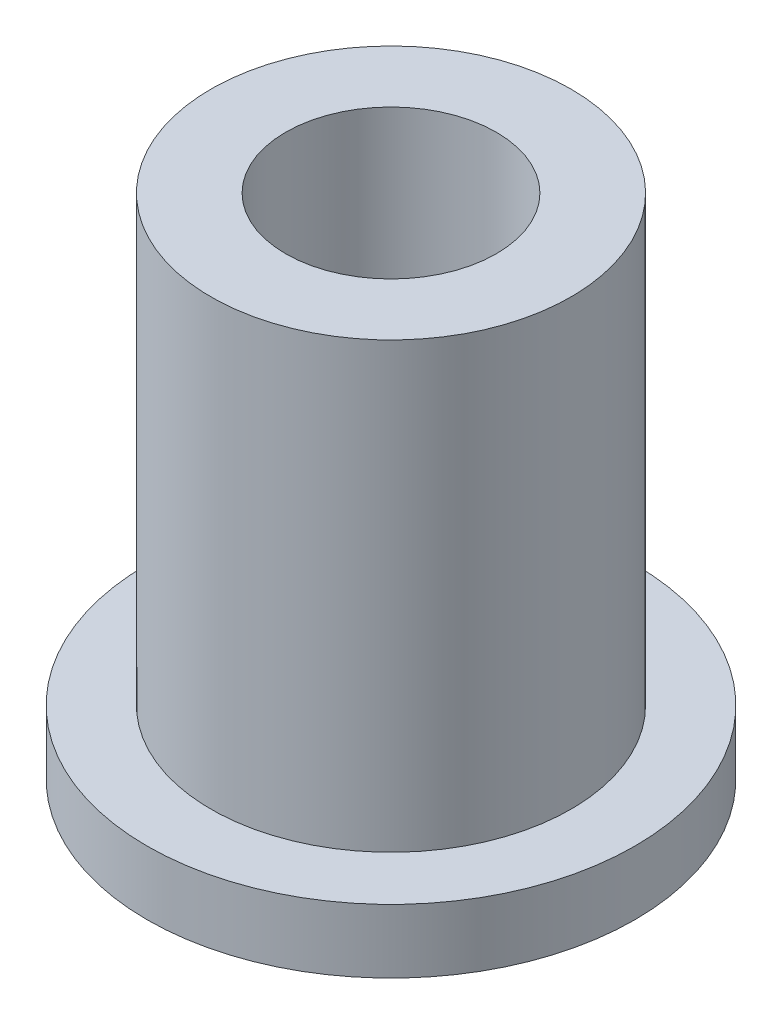
ISO-10303-21;
HEADER;
FILE_DESCRIPTION(('STEP AP214'),'2;1');
FILE_NAME('part.step','',(''),(''),'','','');
FILE_SCHEMA(('AUTOMOTIVE_DESIGN { 1 0 10303 214 1 1 1 1 }'));
ENDSEC;
DATA;
#1=APPLICATION_CONTEXT('core data for automotive mechanical design processes');
#2=APPLICATION_PROTOCOL_DEFINITION('international standard','automotive_design',2000,#1);
#3=PRODUCT_CONTEXT('',#1,'mechanical');
#4=PRODUCT('Part','Part','',(#3));
#5=PRODUCT_RELATED_PRODUCT_CATEGORY('part','',(#4));
#6=PRODUCT_DEFINITION_FORMATION('','',#4);
#7=PRODUCT_DEFINITION_CONTEXT('part definition',#1,'design');
#8=PRODUCT_DEFINITION('design','',#6,#7);
#9=PRODUCT_DEFINITION_SHAPE('','',#8);
#10=(LENGTH_UNIT() NAMED_UNIT(*) SI_UNIT(.MILLI.,.METRE.));
#11=(NAMED_UNIT(*) PLANE_ANGLE_UNIT() SI_UNIT($,.RADIAN.));
#12=(NAMED_UNIT(*) SI_UNIT($,.STERADIAN.) SOLID_ANGLE_UNIT());
#13=UNCERTAINTY_MEASURE_WITH_UNIT(LENGTH_MEASURE(1.E-05),#10,'distance_accuracy_value','');
#14=(GEOMETRIC_REPRESENTATION_CONTEXT(3) GLOBAL_UNCERTAINTY_ASSIGNED_CONTEXT((#13)) GLOBAL_UNIT_ASSIGNED_CONTEXT((#10,
#11,#12)) REPRESENTATION_CONTEXT('',''));
#15=CARTESIAN_POINT('',(0.,0.,0.));
#16=DIRECTION('',(0.,0.,1.));
#17=DIRECTION('',(1.,0.,0.));
#18=AXIS2_PLACEMENT_3D('',#15,#16,#17);
#19=CARTESIAN_POINT('',(0.,0.,0.));
#20=DIRECTION('',(0.,-1.,0.));
#21=DIRECTION('',(0.,0.,-1.));
#22=AXIS2_PLACEMENT_3D('',#19,#20,#21);
#23=PLANE('',#22);
#24=CARTESIAN_POINT('',(0.,0.,0.));
#25=DIRECTION('',(0.,-1.,0.));
#26=DIRECTION('',(0.,0.,-1.));
#27=AXIS2_PLACEMENT_3D('',#24,#25,#26);
#28=CIRCLE('',#27,1.65);
#29=CARTESIAN_POINT('',(0.,0.,-1.65));
#30=VERTEX_POINT('',#29);
#31=EDGE_CURVE('E56',#30,#30,#28,.T.);
#32=ORIENTED_EDGE('',*,*,#31,.F.);
#33=EDGE_LOOP('',(#32));
#34=FACE_BOUND('',#33,.T.);
#35=CARTESIAN_POINT('',(0.,0.,0.));
#36=DIRECTION('',(0.,-1.,0.));
#37=DIRECTION('',(0.,0.,-1.));
#38=AXIS2_PLACEMENT_3D('',#35,#36,#37);
#39=CIRCLE('',#38,3.82);
#40=CARTESIAN_POINT('',(0.,0.,-3.82));
#41=VERTEX_POINT('',#40);
#42=EDGE_CURVE('E10',#41,#41,#39,.T.);
#43=ORIENTED_EDGE('',*,*,#42,.T.);
#44=EDGE_LOOP('',(#43));
#45=FACE_BOUND('',#44,.T.);
#46=ADVANCED_FACE('F34',(#34,#45),#23,.T.);
#47=CARTESIAN_POINT('',(0.,0.,0.));
#48=DIRECTION('',(0.,-1.,0.));
#49=DIRECTION('',(0.,0.,-1.));
#50=AXIS2_PLACEMENT_3D('',#47,#48,#49);
#51=CYLINDRICAL_SURFACE('',#50,3.82);
#52=CARTESIAN_POINT('',(0.,0.999999999999999,0.));
#53=DIRECTION('',(0.,-1.,0.));
#54=DIRECTION('',(0.,0.,-1.));
#55=AXIS2_PLACEMENT_3D('',#52,#53,#54);
#56=CIRCLE('',#55,3.82);
#57=CARTESIAN_POINT('',(0.,0.999999999999999,-3.82));
#58=VERTEX_POINT('',#57);
#59=EDGE_CURVE('E40',#58,#58,#56,.T.);
#60=ORIENTED_EDGE('',*,*,#59,.T.);
#61=EDGE_LOOP('',(#60));
#62=FACE_BOUND('',#61,.T.);
#63=ORIENTED_EDGE('',*,*,#42,.F.);
#64=EDGE_LOOP('',(#63));
#65=FACE_BOUND('',#64,.T.);
#66=ADVANCED_FACE('F63',(#62,#65),#51,.T.);
#67=CARTESIAN_POINT('',(0.,0.999999999999999,-3.82));
#68=DIRECTION('',(0.,1.,0.));
#69=DIRECTION('',(0.,0.,1.));
#70=AXIS2_PLACEMENT_3D('',#67,#68,#69);
#71=PLANE('',#70);
#72=CARTESIAN_POINT('',(0.,0.999999999999999,0.));
#73=DIRECTION('',(0.,-1.,0.));
#74=DIRECTION('',(0.,0.,-1.));
#75=AXIS2_PLACEMENT_3D('',#72,#73,#74);
#76=CIRCLE('',#75,2.82);
#77=CARTESIAN_POINT('',(0.,0.999999999999999,-2.82));
#78=VERTEX_POINT('',#77);
#79=EDGE_CURVE('E44',#78,#78,#76,.T.);
#80=ORIENTED_EDGE('',*,*,#79,.T.);
#81=EDGE_LOOP('',(#80));
#82=FACE_BOUND('',#81,.T.);
#83=ORIENTED_EDGE('',*,*,#59,.F.);
#84=EDGE_LOOP('',(#83));
#85=FACE_BOUND('',#84,.T.);
#86=ADVANCED_FACE('F67',(#82,#85),#71,.T.);
#87=CARTESIAN_POINT('',(0.,0.,0.));
#88=DIRECTION('',(0.,-1.,0.));
#89=DIRECTION('',(0.,0.,-1.));
#90=AXIS2_PLACEMENT_3D('',#87,#88,#89);
#91=CYLINDRICAL_SURFACE('',#90,2.82);
#92=CARTESIAN_POINT('',(0.,7.95,0.));
#93=DIRECTION('',(0.,-1.,0.));
#94=DIRECTION('',(0.,0.,-1.));
#95=AXIS2_PLACEMENT_3D('',#92,#93,#94);
#96=CIRCLE('',#95,2.82);
#97=CARTESIAN_POINT('',(0.,7.95,-2.82));
#98=VERTEX_POINT('',#97);
#99=EDGE_CURVE('E48',#98,#98,#96,.T.);
#100=ORIENTED_EDGE('',*,*,#99,.T.);
#101=EDGE_LOOP('',(#100));
#102=FACE_BOUND('',#101,.T.);
#103=ORIENTED_EDGE('',*,*,#79,.F.);
#104=EDGE_LOOP('',(#103));
#105=FACE_BOUND('',#104,.T.);
#106=ADVANCED_FACE('F71',(#102,#105),#91,.T.);
#107=CARTESIAN_POINT('',(0.,7.95,-2.82));
#108=DIRECTION('',(0.,1.,0.));
#109=DIRECTION('',(0.,0.,1.));
#110=AXIS2_PLACEMENT_3D('',#107,#108,#109);
#111=PLANE('',#110);
#112=CARTESIAN_POINT('',(0.,7.95,0.));
#113=DIRECTION('',(0.,-1.,0.));
#114=DIRECTION('',(0.,0.,-1.));
#115=AXIS2_PLACEMENT_3D('',#112,#113,#114);
#116=CIRCLE('',#115,1.65);
#117=CARTESIAN_POINT('',(0.,7.95,-1.65));
#118=VERTEX_POINT('',#117);
#119=EDGE_CURVE('E53',#118,#118,#116,.T.);
#120=ORIENTED_EDGE('',*,*,#119,.T.);
#121=EDGE_LOOP('',(#120));
#122=FACE_BOUND('',#121,.T.);
#123=ORIENTED_EDGE('',*,*,#99,.F.);
#124=EDGE_LOOP('',(#123));
#125=FACE_BOUND('',#124,.T.);
#126=ADVANCED_FACE('F78',(#122,#125),#111,.T.);
#127=CARTESIAN_POINT('',(0.,0.,0.));
#128=DIRECTION('',(0.,-1.,0.));
#129=DIRECTION('',(0.,0.,-1.));
#130=AXIS2_PLACEMENT_3D('',#127,#128,#129);
#131=CYLINDRICAL_SURFACE('',#130,1.65);
#132=ORIENTED_EDGE('',*,*,#119,.F.);
#133=EDGE_LOOP('',(#132));
#134=FACE_BOUND('',#133,.T.);
#135=ORIENTED_EDGE('',*,*,#31,.T.);
#136=EDGE_LOOP('',(#135));
#137=FACE_BOUND('',#136,.T.);
#138=ADVANCED_FACE('F60',(#134,#137),#131,.F.);
#139=CLOSED_SHELL('',(#46,#66,#86,#106,#126,#138));
#140=MANIFOLD_SOLID_BREP('B2',#139);
#141=ADVANCED_BREP_SHAPE_REPRESENTATION('',(#18,#140),#14);
#142=SHAPE_DEFINITION_REPRESENTATION(#9,#141);
ENDSEC;
END-ISO-10303-21;
